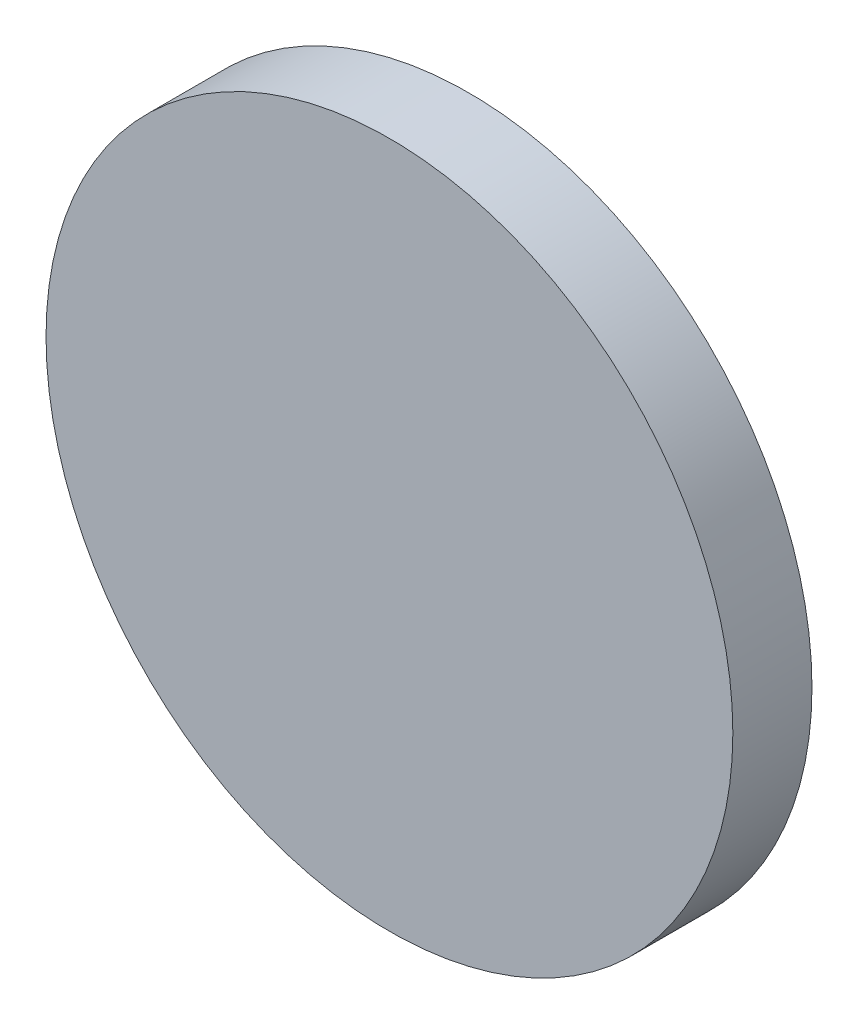
ISO-10303-21;
HEADER;
FILE_DESCRIPTION(('STEP AP214'),'2;1');
FILE_NAME('part.step','',(''),(''),'','','');
FILE_SCHEMA(('AUTOMOTIVE_DESIGN { 1 0 10303 214 1 1 1 1 }'));
ENDSEC;
DATA;
#1=APPLICATION_CONTEXT('core data for automotive mechanical design processes');
#2=APPLICATION_PROTOCOL_DEFINITION('international standard','automotive_design',2000,#1);
#3=PRODUCT_CONTEXT('',#1,'mechanical');
#4=PRODUCT('Part','Part','',(#3));
#5=PRODUCT_RELATED_PRODUCT_CATEGORY('part','',(#4));
#6=PRODUCT_DEFINITION_FORMATION('','',#4);
#7=PRODUCT_DEFINITION_CONTEXT('part definition',#1,'design');
#8=PRODUCT_DEFINITION('design','',#6,#7);
#9=PRODUCT_DEFINITION_SHAPE('','',#8);
#10=(LENGTH_UNIT() NAMED_UNIT(*) SI_UNIT(.MILLI.,.METRE.));
#11=(NAMED_UNIT(*) PLANE_ANGLE_UNIT() SI_UNIT($,.RADIAN.));
#12=(NAMED_UNIT(*) SI_UNIT($,.STERADIAN.) SOLID_ANGLE_UNIT());
#13=UNCERTAINTY_MEASURE_WITH_UNIT(LENGTH_MEASURE(1.E-05),#10,'distance_accuracy_value','');
#14=(GEOMETRIC_REPRESENTATION_CONTEXT(3) GLOBAL_UNCERTAINTY_ASSIGNED_CONTEXT((#13)) GLOBAL_UNIT_ASSIGNED_CONTEXT((#10,
#11,#12)) REPRESENTATION_CONTEXT('',''));
#15=CARTESIAN_POINT('',(0.,0.,0.));
#16=DIRECTION('',(0.,0.,1.));
#17=DIRECTION('',(1.,0.,0.));
#18=AXIS2_PLACEMENT_3D('',#15,#16,#17);
#19=CARTESIAN_POINT('',(0.,0.,5.08));
#20=DIRECTION('',(0.,0.,-1.));
#21=DIRECTION('',(-1.,0.,0.));
#22=AXIS2_PLACEMENT_3D('',#19,#20,#21);
#23=CYLINDRICAL_SURFACE('',#22,22.0472);
#24=CARTESIAN_POINT('',(0.,0.,5.08));
#25=DIRECTION('',(0.,0.,1.));
#26=DIRECTION('',(1.,0.,0.));
#27=AXIS2_PLACEMENT_3D('',#24,#25,#26);
#28=CIRCLE('',#27,22.0472);
#29=CARTESIAN_POINT('',(22.0472,0.,5.08));
#30=VERTEX_POINT('',#29);
#31=EDGE_CURVE('E10',#30,#30,#28,.T.);
#32=ORIENTED_EDGE('',*,*,#31,.F.);
#33=EDGE_LOOP('',(#32));
#34=FACE_BOUND('',#33,.T.);
#35=CARTESIAN_POINT('',(0.,0.,0.));
#36=DIRECTION('',(0.,0.,1.));
#37=DIRECTION('',(1.,0.,0.));
#38=AXIS2_PLACEMENT_3D('',#35,#36,#37);
#39=CIRCLE('',#38,22.0472);
#40=CARTESIAN_POINT('',(22.0472,0.,0.));
#41=VERTEX_POINT('',#40);
#42=EDGE_CURVE('E31',#41,#41,#39,.T.);
#43=ORIENTED_EDGE('',*,*,#42,.T.);
#44=EDGE_LOOP('',(#43));
#45=FACE_BOUND('',#44,.T.);
#46=ADVANCED_FACE('F28',(#34,#45),#23,.T.);
#47=CARTESIAN_POINT('',(0.,0.,5.08));
#48=DIRECTION('',(0.,0.,1.));
#49=DIRECTION('',(1.,0.,0.));
#50=AXIS2_PLACEMENT_3D('',#47,#48,#49);
#51=PLANE('',#50);
#52=ORIENTED_EDGE('',*,*,#31,.T.);
#53=EDGE_LOOP('',(#52));
#54=FACE_BOUND('',#53,.T.);
#55=ADVANCED_FACE('F43',(#54),#51,.T.);
#56=CARTESIAN_POINT('',(0.,0.,0.));
#57=DIRECTION('',(0.,0.,1.));
#58=DIRECTION('',(1.,0.,0.));
#59=AXIS2_PLACEMENT_3D('',#56,#57,#58);
#60=PLANE('',#59);
#61=ORIENTED_EDGE('',*,*,#42,.F.);
#62=EDGE_LOOP('',(#61));
#63=FACE_BOUND('',#62,.T.);
#64=ADVANCED_FACE('F41',(#63),#60,.F.);
#65=CLOSED_SHELL('',(#46,#55,#64));
#66=MANIFOLD_SOLID_BREP('B2',#65);
#67=ADVANCED_BREP_SHAPE_REPRESENTATION('',(#18,#66),#14);
#68=SHAPE_DEFINITION_REPRESENTATION(#9,#67);
ENDSEC;
END-ISO-10303-21;
